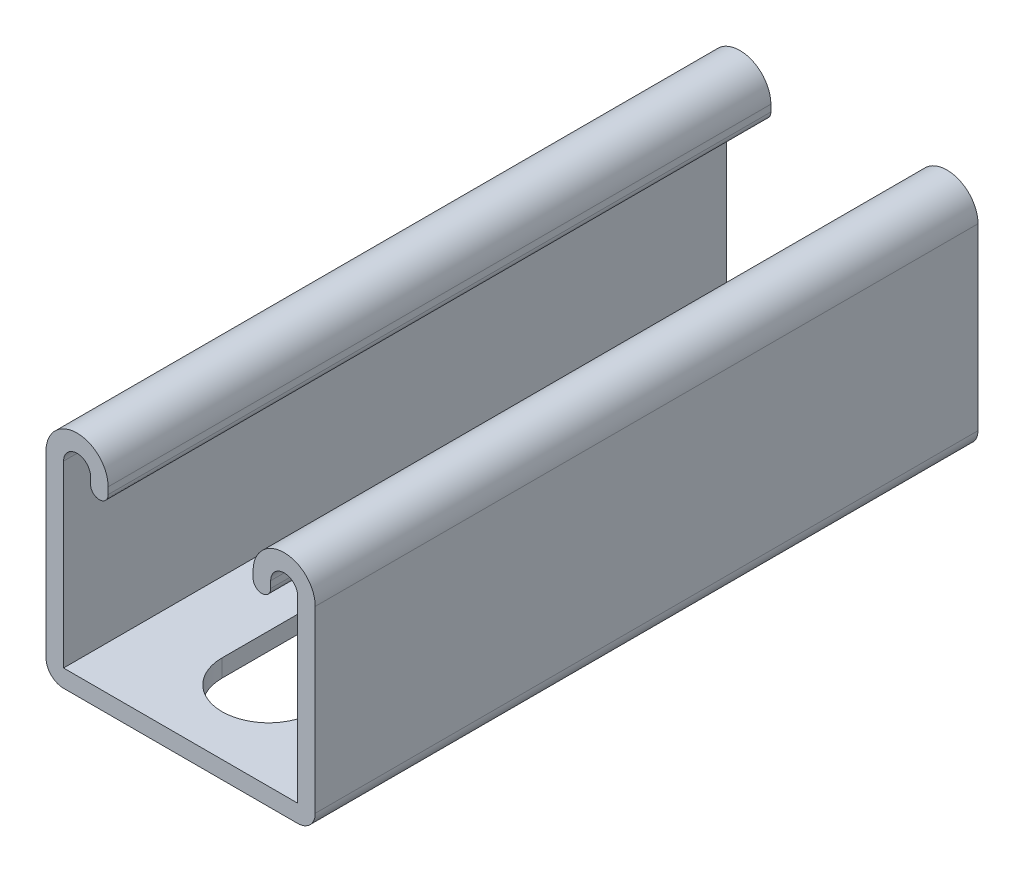
ISO-10303-21;
HEADER;
FILE_DESCRIPTION(('STEP AP214'),'2;1');
FILE_NAME('part.step','',(''),(''),'','','');
FILE_SCHEMA(('AUTOMOTIVE_DESIGN { 1 0 10303 214 1 1 1 1 }'));
ENDSEC;
DATA;
#1=APPLICATION_CONTEXT('core data for automotive mechanical design processes');
#2=APPLICATION_PROTOCOL_DEFINITION('international standard','automotive_design',2000,#1);
#3=PRODUCT_CONTEXT('',#1,'mechanical');
#4=PRODUCT('Part','Part','',(#3));
#5=PRODUCT_RELATED_PRODUCT_CATEGORY('part','',(#4));
#6=PRODUCT_DEFINITION_FORMATION('','',#4);
#7=PRODUCT_DEFINITION_CONTEXT('part definition',#1,'design');
#8=PRODUCT_DEFINITION('design','',#6,#7);
#9=PRODUCT_DEFINITION_SHAPE('','',#8);
#10=(LENGTH_UNIT() NAMED_UNIT(*) SI_UNIT(.MILLI.,.METRE.));
#11=(NAMED_UNIT(*) PLANE_ANGLE_UNIT() SI_UNIT($,.RADIAN.));
#12=(NAMED_UNIT(*) SI_UNIT($,.STERADIAN.) SOLID_ANGLE_UNIT());
#13=UNCERTAINTY_MEASURE_WITH_UNIT(LENGTH_MEASURE(1.E-05),#10,'distance_accuracy_value','');
#14=(GEOMETRIC_REPRESENTATION_CONTEXT(3) GLOBAL_UNCERTAINTY_ASSIGNED_CONTEXT((#13)) GLOBAL_UNIT_ASSIGNED_CONTEXT((#10,
#11,#12)) REPRESENTATION_CONTEXT('',''));
#15=CARTESIAN_POINT('',(0.,0.,0.));
#16=DIRECTION('',(0.,0.,1.));
#17=DIRECTION('',(1.,0.,0.));
#18=AXIS2_PLACEMENT_3D('',#15,#16,#17);
#19=CARTESIAN_POINT('',(-15.875,15.1511,101.6));
#20=DIRECTION('',(0.,0.,-1.));
#21=DIRECTION('',(-1.,0.,0.));
#22=AXIS2_PLACEMENT_3D('',#19,#20,#21);
#23=CYLINDRICAL_SURFACE('',#22,4.7625);
#24=CARTESIAN_POINT('',(-15.875,15.1511,0.));
#25=DIRECTION('',(0.,0.,1.));
#26=DIRECTION('',(-1.,0.,0.));
#27=AXIS2_PLACEMENT_3D('',#24,#25,#26);
#28=CIRCLE('',#27,4.7625);
#29=CARTESIAN_POINT('',(-11.1125,15.1511,0.));
#30=VERTEX_POINT('',#29);
#31=CARTESIAN_POINT('',(-20.6375,15.1511,0.));
#32=VERTEX_POINT('',#31);
#33=EDGE_CURVE('E253',#30,#32,#28,.T.);
#34=ORIENTED_EDGE('',*,*,#33,.T.);
#35=DIRECTION('',(0.,0.,-1.));
#36=VECTOR('',#35,1.);
#37=CARTESIAN_POINT('',(-20.6375,15.1511,101.6));
#38=LINE('',#37,#36);
#39=CARTESIAN_POINT('',(-20.6375,15.1511,101.6));
#40=VERTEX_POINT('',#39);
#41=EDGE_CURVE('E384',#40,#32,#38,.T.);
#42=ORIENTED_EDGE('',*,*,#41,.F.);
#43=CARTESIAN_POINT('',(-15.875,15.1511,101.6));
#44=DIRECTION('',(0.,0.,1.));
#45=DIRECTION('',(-1.,0.,0.));
#46=AXIS2_PLACEMENT_3D('',#43,#44,#45);
#47=CIRCLE('',#46,4.7625);
#48=CARTESIAN_POINT('',(-11.1125,15.1511,101.6));
#49=VERTEX_POINT('',#48);
#50=EDGE_CURVE('E260',#49,#40,#47,.T.);
#51=ORIENTED_EDGE('',*,*,#50,.F.);
#52=DIRECTION('',(0.,0.,-1.));
#53=VECTOR('',#52,1.);
#54=CARTESIAN_POINT('',(-11.1125,15.1511,101.6));
#55=LINE('',#54,#53);
#56=EDGE_CURVE('E298',#49,#30,#55,.T.);
#57=ORIENTED_EDGE('',*,*,#56,.T.);
#58=EDGE_LOOP('',(#34,#42,#51,#57));
#59=FACE_BOUND('',#58,.T.);
#60=ADVANCED_FACE('F32',(#59),#23,.T.);
#61=CARTESIAN_POINT('',(-20.6375,15.1511,101.6));
#62=DIRECTION('',(1.,0.,0.));
#63=DIRECTION('',(0.,1.,0.));
#64=AXIS2_PLACEMENT_3D('',#61,#62,#63);
#65=PLANE('',#64);
#66=DIRECTION('',(0.,-1.,0.));
#67=VECTOR('',#66,1.);
#68=CARTESIAN_POINT('',(-20.6375,15.1511,0.));
#69=LINE('',#68,#67);
#70=CARTESIAN_POINT('',(-20.6375,-12.319,0.));
#71=VERTEX_POINT('',#70);
#72=EDGE_CURVE('E301',#32,#71,#69,.T.);
#73=ORIENTED_EDGE('',*,*,#72,.T.);
#74=DIRECTION('',(0.,0.,-1.));
#75=VECTOR('',#74,1.);
#76=CARTESIAN_POINT('',(-20.6375,-12.319,101.6));
#77=LINE('',#76,#75);
#78=CARTESIAN_POINT('',(-20.6375,-12.319,101.6));
#79=VERTEX_POINT('',#78);
#80=EDGE_CURVE('E381',#79,#71,#77,.T.);
#81=ORIENTED_EDGE('',*,*,#80,.F.);
#82=DIRECTION('',(0.,-1.,0.));
#83=VECTOR('',#82,1.);
#84=CARTESIAN_POINT('',(-20.6375,15.1511,101.6));
#85=LINE('',#84,#83);
#86=EDGE_CURVE('E263',#40,#79,#85,.T.);
#87=ORIENTED_EDGE('',*,*,#86,.F.);
#88=ORIENTED_EDGE('',*,*,#41,.T.);
#89=EDGE_LOOP('',(#73,#81,#87,#88));
#90=FACE_BOUND('',#89,.T.);
#91=ADVANCED_FACE('F425',(#90),#65,.F.);
#92=CARTESIAN_POINT('',(-17.9451,-12.319,101.6));
#93=DIRECTION('',(0.,0.,-1.));
#94=DIRECTION('',(-1.,0.,0.));
#95=AXIS2_PLACEMENT_3D('',#92,#93,#94);
#96=CYLINDRICAL_SURFACE('',#95,2.6924);
#97=CARTESIAN_POINT('',(-17.9451,-12.319,0.));
#98=DIRECTION('',(0.,0.,1.));
#99=DIRECTION('',(-1.,0.,0.));
#100=AXIS2_PLACEMENT_3D('',#97,#98,#99);
#101=CIRCLE('',#100,2.6924);
#102=CARTESIAN_POINT('',(-17.9451,-15.0114,0.));
#103=VERTEX_POINT('',#102);
#104=EDGE_CURVE('E303',#71,#103,#101,.T.);
#105=ORIENTED_EDGE('',*,*,#104,.T.);
#106=DIRECTION('',(0.,0.,-1.));
#107=VECTOR('',#106,1.);
#108=CARTESIAN_POINT('',(-17.9451,-15.0114,101.6));
#109=LINE('',#108,#107);
#110=CARTESIAN_POINT('',(-17.9451,-15.0114,101.6));
#111=VERTEX_POINT('',#110);
#112=EDGE_CURVE('E378',#111,#103,#109,.T.);
#113=ORIENTED_EDGE('',*,*,#112,.F.);
#114=CARTESIAN_POINT('',(-17.9451,-12.319,101.6));
#115=DIRECTION('',(0.,0.,1.));
#116=DIRECTION('',(-1.,0.,0.));
#117=AXIS2_PLACEMENT_3D('',#114,#115,#116);
#118=CIRCLE('',#117,2.6924);
#119=EDGE_CURVE('E266',#79,#111,#118,.T.);
#120=ORIENTED_EDGE('',*,*,#119,.F.);
#121=ORIENTED_EDGE('',*,*,#80,.T.);
#122=EDGE_LOOP('',(#105,#113,#120,#121));
#123=FACE_BOUND('',#122,.T.);
#124=ADVANCED_FACE('F430',(#123),#96,.T.);
#125=CARTESIAN_POINT('',(-17.9451,-15.0114,101.6));
#126=DIRECTION('',(0.,1.,0.));
#127=DIRECTION('',(-1.,0.,0.));
#128=AXIS2_PLACEMENT_3D('',#125,#126,#127);
#129=PLANE('',#128);
#130=DIRECTION('',(0.,0.,-1.));
#131=VECTOR('',#130,1.);
#132=CARTESIAN_POINT('',(-7.14375,-15.0113999999917,73.81875));
#133=LINE('',#132,#131);
#134=CARTESIAN_POINT('',(-7.14375,-15.0114,88.10625));
#135=VERTEX_POINT('',#134);
#136=CARTESIAN_POINT('',(-7.14375,-15.0113999999917,73.81875));
#137=VERTEX_POINT('',#136);
#138=EDGE_CURVE('E206',#135,#137,#133,.T.);
#139=ORIENTED_EDGE('',*,*,#138,.F.);
#140=CARTESIAN_POINT('',(0.,-15.0113999999917,88.10625));
#141=DIRECTION('',(0.,-1.,0.));
#142=DIRECTION('',(1.,0.,0.));
#143=AXIS2_PLACEMENT_3D('',#140,#141,#142);
#144=CIRCLE('',#143,7.14375);
#145=CARTESIAN_POINT('',(7.14375,-15.0113999999917,88.10625));
#146=VERTEX_POINT('',#145);
#147=EDGE_CURVE('E46',#146,#135,#144,.T.);
#148=ORIENTED_EDGE('',*,*,#147,.F.);
#149=DIRECTION('',(0.,0.,1.));
#150=VECTOR('',#149,1.);
#151=CARTESIAN_POINT('',(7.14375,-15.0113999999917,88.10625));
#152=LINE('',#151,#150);
#153=CARTESIAN_POINT('',(7.14375,-15.0113999999917,73.81875));
#154=VERTEX_POINT('',#153);
#155=EDGE_CURVE('E222',#154,#146,#152,.T.);
#156=ORIENTED_EDGE('',*,*,#155,.F.);
#157=CARTESIAN_POINT('',(0.,-15.0113999999917,73.81875));
#158=DIRECTION('',(0.,-1.,0.));
#159=DIRECTION('',(1.,0.,0.));
#160=AXIS2_PLACEMENT_3D('',#157,#158,#159);
#161=CIRCLE('',#160,7.14375);
#162=EDGE_CURVE('E216',#137,#154,#161,.T.);
#163=ORIENTED_EDGE('',*,*,#162,.F.);
#164=EDGE_LOOP('',(#139,#148,#156,#163));
#165=FACE_BOUND('',#164,.T.);
#166=DIRECTION('',(0.,0.,-1.));
#167=VECTOR('',#166,1.);
#168=CARTESIAN_POINT('',(-7.14375,-15.0113999999917,23.01875));
#169=LINE('',#168,#167);
#170=CARTESIAN_POINT('',(-7.14375,-15.0114,37.30625));
#171=VERTEX_POINT('',#170);
#172=CARTESIAN_POINT('',(-7.14375,-15.0113999999917,23.01875));
#173=VERTEX_POINT('',#172);
#174=EDGE_CURVE('E241',#171,#173,#169,.T.);
#175=ORIENTED_EDGE('',*,*,#174,.F.);
#176=CARTESIAN_POINT('',(0.,-15.0113999999917,37.30625));
#177=DIRECTION('',(0.,-1.,0.));
#178=DIRECTION('',(1.,0.,0.));
#179=AXIS2_PLACEMENT_3D('',#176,#177,#178);
#180=CIRCLE('',#179,7.14375);
#181=CARTESIAN_POINT('',(7.14375,-15.0113999999917,37.30625));
#182=VERTEX_POINT('',#181);
#183=EDGE_CURVE('E239',#182,#171,#180,.T.);
#184=ORIENTED_EDGE('',*,*,#183,.F.);
#185=DIRECTION('',(0.,0.,1.));
#186=VECTOR('',#185,1.);
#187=CARTESIAN_POINT('',(7.14375,-15.0113999999917,37.30625));
#188=LINE('',#187,#186);
#189=CARTESIAN_POINT('',(7.14375,-15.0113999999917,23.01875));
#190=VERTEX_POINT('',#189);
#191=EDGE_CURVE('E247',#190,#182,#188,.T.);
#192=ORIENTED_EDGE('',*,*,#191,.F.);
#193=CARTESIAN_POINT('',(0.,-15.0113999999917,23.01875));
#194=DIRECTION('',(0.,-1.,0.));
#195=DIRECTION('',(1.,0.,0.));
#196=AXIS2_PLACEMENT_3D('',#193,#194,#195);
#197=CIRCLE('',#196,7.14375);
#198=EDGE_CURVE('E244',#173,#190,#197,.T.);
#199=ORIENTED_EDGE('',*,*,#198,.F.);
#200=EDGE_LOOP('',(#175,#184,#192,#199));
#201=FACE_BOUND('',#200,.T.);
#202=DIRECTION('',(1.,0.,0.));
#203=VECTOR('',#202,1.);
#204=CARTESIAN_POINT('',(-17.9451,-15.0114,0.));
#205=LINE('',#204,#203);
#206=CARTESIAN_POINT('',(17.9451,-15.0114,0.));
#207=VERTEX_POINT('',#206);
#208=EDGE_CURVE('E305',#103,#207,#205,.T.);
#209=ORIENTED_EDGE('',*,*,#208,.T.);
#210=DIRECTION('',(0.,0.,-1.));
#211=VECTOR('',#210,1.);
#212=CARTESIAN_POINT('',(17.9451,-15.0114,101.6));
#213=LINE('',#212,#211);
#214=CARTESIAN_POINT('',(17.9451,-15.0114,101.6));
#215=VERTEX_POINT('',#214);
#216=EDGE_CURVE('E375',#215,#207,#213,.T.);
#217=ORIENTED_EDGE('',*,*,#216,.F.);
#218=DIRECTION('',(1.,0.,0.));
#219=VECTOR('',#218,1.);
#220=CARTESIAN_POINT('',(-17.9451,-15.0114,101.6));
#221=LINE('',#220,#219);
#222=EDGE_CURVE('E268',#111,#215,#221,.T.);
#223=ORIENTED_EDGE('',*,*,#222,.F.);
#224=ORIENTED_EDGE('',*,*,#112,.T.);
#225=EDGE_LOOP('',(#209,#217,#223,#224));
#226=FACE_BOUND('',#225,.T.);
#227=ADVANCED_FACE('F220',(#165,#201,#226),#129,.F.);
#228=CARTESIAN_POINT('',(17.9451,-12.319,101.6));
#229=DIRECTION('',(0.,0.,-1.));
#230=DIRECTION('',(-1.,0.,0.));
#231=AXIS2_PLACEMENT_3D('',#228,#229,#230);
#232=CYLINDRICAL_SURFACE('',#231,2.6924);
#233=CARTESIAN_POINT('',(17.9451,-12.319,0.));
#234=DIRECTION('',(0.,0.,1.));
#235=DIRECTION('',(1.,0.,0.));
#236=AXIS2_PLACEMENT_3D('',#233,#234,#235);
#237=CIRCLE('',#236,2.6924);
#238=CARTESIAN_POINT('',(20.6375,-12.319,0.));
#239=VERTEX_POINT('',#238);
#240=EDGE_CURVE('E307',#207,#239,#237,.T.);
#241=ORIENTED_EDGE('',*,*,#240,.T.);
#242=DIRECTION('',(0.,0.,-1.));
#243=VECTOR('',#242,1.);
#244=CARTESIAN_POINT('',(20.6375,-12.319,101.6));
#245=LINE('',#244,#243);
#246=CARTESIAN_POINT('',(20.6375,-12.319,101.6));
#247=VERTEX_POINT('',#246);
#248=EDGE_CURVE('E372',#247,#239,#245,.T.);
#249=ORIENTED_EDGE('',*,*,#248,.F.);
#250=CARTESIAN_POINT('',(17.9451,-12.319,101.6));
#251=DIRECTION('',(0.,0.,1.));
#252=DIRECTION('',(1.,0.,0.));
#253=AXIS2_PLACEMENT_3D('',#250,#251,#252);
#254=CIRCLE('',#253,2.6924);
#255=EDGE_CURVE('E270',#215,#247,#254,.T.);
#256=ORIENTED_EDGE('',*,*,#255,.F.);
#257=ORIENTED_EDGE('',*,*,#216,.T.);
#258=EDGE_LOOP('',(#241,#249,#256,#257));
#259=FACE_BOUND('',#258,.T.);
#260=ADVANCED_FACE('F510',(#259),#232,.T.);
#261=CARTESIAN_POINT('',(20.6375,-12.319,101.6));
#262=DIRECTION('',(-1.,0.,0.));
#263=DIRECTION('',(0.,0.,1.));
#264=AXIS2_PLACEMENT_3D('',#261,#262,#263);
#265=PLANE('',#264);
#266=DIRECTION('',(0.,1.,0.));
#267=VECTOR('',#266,1.);
#268=CARTESIAN_POINT('',(20.6375,-12.319,0.));
#269=LINE('',#268,#267);
#270=CARTESIAN_POINT('',(20.6375,15.1511,0.));
#271=VERTEX_POINT('',#270);
#272=EDGE_CURVE('E309',#239,#271,#269,.T.);
#273=ORIENTED_EDGE('',*,*,#272,.T.);
#274=DIRECTION('',(0.,0.,-1.));
#275=VECTOR('',#274,1.);
#276=CARTESIAN_POINT('',(20.6375,15.1511,101.6));
#277=LINE('',#276,#275);
#278=CARTESIAN_POINT('',(20.6375,15.1511,101.6));
#279=VERTEX_POINT('',#278);
#280=EDGE_CURVE('E369',#279,#271,#277,.T.);
#281=ORIENTED_EDGE('',*,*,#280,.F.);
#282=DIRECTION('',(0.,1.,0.));
#283=VECTOR('',#282,1.);
#284=CARTESIAN_POINT('',(20.6375,-12.319,101.6));
#285=LINE('',#284,#283);
#286=EDGE_CURVE('E272',#247,#279,#285,.T.);
#287=ORIENTED_EDGE('',*,*,#286,.F.);
#288=ORIENTED_EDGE('',*,*,#248,.T.);
#289=EDGE_LOOP('',(#273,#281,#287,#288));
#290=FACE_BOUND('',#289,.T.);
#291=ADVANCED_FACE('F506',(#290),#265,.F.);
#292=CARTESIAN_POINT('',(15.875,15.1511,101.6));
#293=DIRECTION('',(0.,0.,-1.));
#294=DIRECTION('',(-1.,0.,0.));
#295=AXIS2_PLACEMENT_3D('',#292,#293,#294);
#296=CYLINDRICAL_SURFACE('',#295,4.7625);
#297=CARTESIAN_POINT('',(15.875,15.1511,0.));
#298=DIRECTION('',(0.,0.,1.));
#299=DIRECTION('',(1.,0.,0.));
#300=AXIS2_PLACEMENT_3D('',#297,#298,#299);
#301=CIRCLE('',#300,4.7625);
#302=CARTESIAN_POINT('',(11.1125,15.1511,0.));
#303=VERTEX_POINT('',#302);
#304=EDGE_CURVE('E311',#271,#303,#301,.T.);
#305=ORIENTED_EDGE('',*,*,#304,.T.);
#306=DIRECTION('',(0.,0.,-1.));
#307=VECTOR('',#306,1.);
#308=CARTESIAN_POINT('',(11.1125,15.1511,101.6));
#309=LINE('',#308,#307);
#310=CARTESIAN_POINT('',(11.1125,15.1511,101.6));
#311=VERTEX_POINT('',#310);
#312=EDGE_CURVE('E366',#311,#303,#309,.T.);
#313=ORIENTED_EDGE('',*,*,#312,.F.);
#314=CARTESIAN_POINT('',(15.875,15.1511,101.6));
#315=DIRECTION('',(0.,0.,1.));
#316=DIRECTION('',(1.,0.,0.));
#317=AXIS2_PLACEMENT_3D('',#314,#315,#316);
#318=CIRCLE('',#317,4.7625);
#319=EDGE_CURVE('E274',#279,#311,#318,.T.);
#320=ORIENTED_EDGE('',*,*,#319,.F.);
#321=ORIENTED_EDGE('',*,*,#280,.T.);
#322=EDGE_LOOP('',(#305,#313,#320,#321));
#323=FACE_BOUND('',#322,.T.);
#324=ADVANCED_FACE('F501',(#323),#296,.T.);
#325=CARTESIAN_POINT('',(11.1125,15.1511,101.6));
#326=DIRECTION('',(1.,0.,0.));
#327=DIRECTION('',(0.,1.,0.));
#328=AXIS2_PLACEMENT_3D('',#325,#326,#327);
#329=PLANE('',#328);
#330=DIRECTION('',(0.,-1.,0.));
#331=VECTOR('',#330,1.);
#332=CARTESIAN_POINT('',(11.1125,15.1511,0.));
#333=LINE('',#332,#331);
#334=CARTESIAN_POINT('',(11.1125,14.11605,0.));
#335=VERTEX_POINT('',#334);
#336=EDGE_CURVE('E313',#303,#335,#333,.T.);
#337=ORIENTED_EDGE('',*,*,#336,.T.);
#338=DIRECTION('',(0.,0.,-1.));
#339=VECTOR('',#338,1.);
#340=CARTESIAN_POINT('',(11.1125,14.11605,101.6));
#341=LINE('',#340,#339);
#342=CARTESIAN_POINT('',(11.1125,14.11605,101.6));
#343=VERTEX_POINT('',#342);
#344=EDGE_CURVE('E363',#343,#335,#341,.T.);
#345=ORIENTED_EDGE('',*,*,#344,.F.);
#346=DIRECTION('',(0.,-1.,0.));
#347=VECTOR('',#346,1.);
#348=CARTESIAN_POINT('',(11.1125,15.1511,101.6));
#349=LINE('',#348,#347);
#350=EDGE_CURVE('E276',#311,#343,#349,.T.);
#351=ORIENTED_EDGE('',*,*,#350,.F.);
#352=ORIENTED_EDGE('',*,*,#312,.T.);
#353=EDGE_LOOP('',(#337,#345,#351,#352));
#354=FACE_BOUND('',#353,.T.);
#355=ADVANCED_FACE('F495',(#354),#329,.F.);
#356=CARTESIAN_POINT('',(12.4587,14.11605,101.6));
#357=DIRECTION('',(0.,0.,-1.));
#358=DIRECTION('',(-1.,0.,0.));
#359=AXIS2_PLACEMENT_3D('',#356,#357,#358);
#360=CYLINDRICAL_SURFACE('',#359,1.3462);
#361=CARTESIAN_POINT('',(12.4587,14.11605,0.));
#362=DIRECTION('',(0.,0.,1.));
#363=DIRECTION('',(1.,0.,0.));
#364=AXIS2_PLACEMENT_3D('',#361,#362,#363);
#365=CIRCLE('',#364,1.3462);
#366=CARTESIAN_POINT('',(13.8049,14.11605,0.));
#367=VERTEX_POINT('',#366);
#368=EDGE_CURVE('E315',#335,#367,#365,.T.);
#369=ORIENTED_EDGE('',*,*,#368,.T.);
#370=DIRECTION('',(0.,0.,-1.));
#371=VECTOR('',#370,1.);
#372=CARTESIAN_POINT('',(13.8049,14.11605,101.6));
#373=LINE('',#372,#371);
#374=CARTESIAN_POINT('',(13.8049,14.11605,101.6));
#375=VERTEX_POINT('',#374);
#376=EDGE_CURVE('E360',#375,#367,#373,.T.);
#377=ORIENTED_EDGE('',*,*,#376,.F.);
#378=CARTESIAN_POINT('',(12.4587,14.11605,101.6));
#379=DIRECTION('',(0.,0.,1.));
#380=DIRECTION('',(1.,0.,0.));
#381=AXIS2_PLACEMENT_3D('',#378,#379,#380);
#382=CIRCLE('',#381,1.3462);
#383=EDGE_CURVE('E278',#343,#375,#382,.T.);
#384=ORIENTED_EDGE('',*,*,#383,.F.);
#385=ORIENTED_EDGE('',*,*,#344,.T.);
#386=EDGE_LOOP('',(#369,#377,#384,#385));
#387=FACE_BOUND('',#386,.T.);
#388=ADVANCED_FACE('F491',(#387),#360,.T.);
#389=CARTESIAN_POINT('',(13.8049,15.1511,101.6));
#390=DIRECTION('',(-1.,0.,0.));
#391=DIRECTION('',(0.,0.,1.));
#392=AXIS2_PLACEMENT_3D('',#389,#390,#391);
#393=PLANE('',#392);
#394=DIRECTION('',(0.,1.,0.));
#395=VECTOR('',#394,1.);
#396=CARTESIAN_POINT('',(13.8049,15.1511,0.));
#397=LINE('',#396,#395);
#398=CARTESIAN_POINT('',(13.8049,15.1511,0.));
#399=VERTEX_POINT('',#398);
#400=EDGE_CURVE('E317',#367,#399,#397,.T.);
#401=ORIENTED_EDGE('',*,*,#400,.T.);
#402=DIRECTION('',(0.,0.,-1.));
#403=VECTOR('',#402,1.);
#404=CARTESIAN_POINT('',(13.8049,15.1511,101.6));
#405=LINE('',#404,#403);
#406=CARTESIAN_POINT('',(13.8049,15.1511,101.6));
#407=VERTEX_POINT('',#406);
#408=EDGE_CURVE('E357',#407,#399,#405,.T.);
#409=ORIENTED_EDGE('',*,*,#408,.F.);
#410=DIRECTION('',(0.,1.,0.));
#411=VECTOR('',#410,1.);
#412=CARTESIAN_POINT('',(13.8049,15.1511,101.6));
#413=LINE('',#412,#411);
#414=EDGE_CURVE('E280',#375,#407,#413,.T.);
#415=ORIENTED_EDGE('',*,*,#414,.F.);
#416=ORIENTED_EDGE('',*,*,#376,.T.);
#417=EDGE_LOOP('',(#401,#409,#415,#416));
#418=FACE_BOUND('',#417,.T.);
#419=ADVANCED_FACE('F486',(#418),#393,.F.);
#420=CARTESIAN_POINT('',(15.875,15.1511,101.6));
#421=DIRECTION('',(0.,0.,-1.));
#422=DIRECTION('',(-1.,0.,0.));
#423=AXIS2_PLACEMENT_3D('',#420,#421,#422);
#424=CYLINDRICAL_SURFACE('',#423,2.0701);
#425=CARTESIAN_POINT('',(15.875,15.1511,0.));
#426=DIRECTION('',(0.,0.,-1.));
#427=DIRECTION('',(1.,0.,0.));
#428=AXIS2_PLACEMENT_3D('',#425,#426,#427);
#429=CIRCLE('',#428,2.0701);
#430=CARTESIAN_POINT('',(17.9451,15.1511,0.));
#431=VERTEX_POINT('',#430);
#432=EDGE_CURVE('E319',#399,#431,#429,.T.);
#433=ORIENTED_EDGE('',*,*,#432,.T.);
#434=DIRECTION('',(0.,0.,-1.));
#435=VECTOR('',#434,1.);
#436=CARTESIAN_POINT('',(17.9451,15.1511,101.6));
#437=LINE('',#436,#435);
#438=CARTESIAN_POINT('',(17.9451,15.1511,101.6));
#439=VERTEX_POINT('',#438);
#440=EDGE_CURVE('E354',#439,#431,#437,.T.);
#441=ORIENTED_EDGE('',*,*,#440,.F.);
#442=CARTESIAN_POINT('',(15.875,15.1511,101.6));
#443=DIRECTION('',(0.,0.,-1.));
#444=DIRECTION('',(1.,0.,0.));
#445=AXIS2_PLACEMENT_3D('',#442,#443,#444);
#446=CIRCLE('',#445,2.0701);
#447=EDGE_CURVE('E282',#407,#439,#446,.T.);
#448=ORIENTED_EDGE('',*,*,#447,.F.);
#449=ORIENTED_EDGE('',*,*,#408,.T.);
#450=EDGE_LOOP('',(#433,#441,#448,#449));
#451=FACE_BOUND('',#450,.T.);
#452=ADVANCED_FACE('F480',(#451),#424,.F.);
#453=CARTESIAN_POINT('',(17.9451,-12.319,101.6));
#454=DIRECTION('',(1.,0.,0.));
#455=DIRECTION('',(0.,1.,0.));
#456=AXIS2_PLACEMENT_3D('',#453,#454,#455);
#457=PLANE('',#456);
#458=DIRECTION('',(0.,-1.,0.));
#459=VECTOR('',#458,1.);
#460=CARTESIAN_POINT('',(17.9451,-12.319,0.));
#461=LINE('',#460,#459);
#462=CARTESIAN_POINT('',(17.9451,-12.319,0.));
#463=VERTEX_POINT('',#462);
#464=EDGE_CURVE('E321',#431,#463,#461,.T.);
#465=ORIENTED_EDGE('',*,*,#464,.T.);
#466=DIRECTION('',(0.,0.,-1.));
#467=VECTOR('',#466,1.);
#468=CARTESIAN_POINT('',(17.9451,-12.319,101.6));
#469=LINE('',#468,#467);
#470=CARTESIAN_POINT('',(17.9451,-12.319,101.6));
#471=VERTEX_POINT('',#470);
#472=EDGE_CURVE('E351',#471,#463,#469,.T.);
#473=ORIENTED_EDGE('',*,*,#472,.F.);
#474=DIRECTION('',(0.,-1.,0.));
#475=VECTOR('',#474,1.);
#476=CARTESIAN_POINT('',(17.9451,-12.319,101.6));
#477=LINE('',#476,#475);
#478=EDGE_CURVE('E284',#439,#471,#477,.T.);
#479=ORIENTED_EDGE('',*,*,#478,.F.);
#480=ORIENTED_EDGE('',*,*,#440,.T.);
#481=EDGE_LOOP('',(#465,#473,#479,#480));
#482=FACE_BOUND('',#481,.T.);
#483=ADVANCED_FACE('F476',(#482),#457,.F.);
#484=CARTESIAN_POINT('',(-17.9451,-12.319,101.6));
#485=DIRECTION('',(0.,-1.,0.));
#486=DIRECTION('',(0.,0.,-1.));
#487=AXIS2_PLACEMENT_3D('',#484,#485,#486);
#488=PLANE('',#487);
#489=DIRECTION('',(0.,0.,1.));
#490=VECTOR('',#489,1.);
#491=CARTESIAN_POINT('',(7.14374999999998,-12.319,152.4));
#492=LINE('',#491,#490);
#493=CARTESIAN_POINT('',(7.14375,-12.319,73.81875));
#494=VERTEX_POINT('',#493);
#495=CARTESIAN_POINT('',(7.14375,-12.319,88.10625));
#496=VERTEX_POINT('',#495);
#497=EDGE_CURVE('E232',#494,#496,#492,.T.);
#498=ORIENTED_EDGE('',*,*,#497,.T.);
#499=CARTESIAN_POINT('',(0.,-12.319,88.10625));
#500=DIRECTION('',(0.,-1.,0.));
#501=DIRECTION('',(0.,0.,-1.));
#502=AXIS2_PLACEMENT_3D('',#499,#500,#501);
#503=CIRCLE('',#502,7.14375);
#504=CARTESIAN_POINT('',(-7.14375,-12.319,88.10625));
#505=VERTEX_POINT('',#504);
#506=EDGE_CURVE('E236',#496,#505,#503,.T.);
#507=ORIENTED_EDGE('',*,*,#506,.T.);
#508=DIRECTION('',(0.,0.,-1.));
#509=VECTOR('',#508,1.);
#510=CARTESIAN_POINT('',(-7.14375,-12.319,152.4));
#511=LINE('',#510,#509);
#512=CARTESIAN_POINT('',(-7.14375,-12.319,73.81875));
#513=VERTEX_POINT('',#512);
#514=EDGE_CURVE('E213',#505,#513,#511,.T.);
#515=ORIENTED_EDGE('',*,*,#514,.T.);
#516=CARTESIAN_POINT('',(0.,-12.319,73.81875));
#517=DIRECTION('',(0.,-1.,0.));
#518=DIRECTION('',(0.,0.,-1.));
#519=AXIS2_PLACEMENT_3D('',#516,#517,#518);
#520=CIRCLE('',#519,7.14375);
#521=EDGE_CURVE('E54',#513,#494,#520,.T.);
#522=ORIENTED_EDGE('',*,*,#521,.T.);
#523=EDGE_LOOP('',(#498,#507,#515,#522));
#524=FACE_BOUND('',#523,.T.);
#525=DIRECTION('',(0.,0.,1.));
#526=VECTOR('',#525,1.);
#527=CARTESIAN_POINT('',(7.14374999999998,-12.319,101.6));
#528=LINE('',#527,#526);
#529=CARTESIAN_POINT('',(7.14375,-12.319,23.01875));
#530=VERTEX_POINT('',#529);
#531=CARTESIAN_POINT('',(7.14375,-12.319,37.30625));
#532=VERTEX_POINT('',#531);
#533=EDGE_CURVE('E39',#530,#532,#528,.T.);
#534=ORIENTED_EDGE('',*,*,#533,.T.);
#535=CARTESIAN_POINT('',(0.,-12.319,37.30625));
#536=DIRECTION('',(0.,-1.,0.));
#537=DIRECTION('',(0.,0.,-1.));
#538=AXIS2_PLACEMENT_3D('',#535,#536,#537);
#539=CIRCLE('',#538,7.14375);
#540=CARTESIAN_POINT('',(-7.14375,-12.319,37.30625));
#541=VERTEX_POINT('',#540);
#542=EDGE_CURVE('E11',#532,#541,#539,.T.);
#543=ORIENTED_EDGE('',*,*,#542,.T.);
#544=DIRECTION('',(0.,0.,-1.));
#545=VECTOR('',#544,1.);
#546=CARTESIAN_POINT('',(-7.14375,-12.319,101.6));
#547=LINE('',#546,#545);
#548=CARTESIAN_POINT('',(-7.14375,-12.319,23.01875));
#549=VERTEX_POINT('',#548);
#550=EDGE_CURVE('E387',#541,#549,#547,.T.);
#551=ORIENTED_EDGE('',*,*,#550,.T.);
#552=CARTESIAN_POINT('',(0.,-12.319,23.01875));
#553=DIRECTION('',(0.,-1.,0.));
#554=DIRECTION('',(0.,0.,-1.));
#555=AXIS2_PLACEMENT_3D('',#552,#553,#554);
#556=CIRCLE('',#555,7.14375);
#557=EDGE_CURVE('E390',#549,#530,#556,.T.);
#558=ORIENTED_EDGE('',*,*,#557,.T.);
#559=EDGE_LOOP('',(#534,#543,#551,#558));
#560=FACE_BOUND('',#559,.T.);
#561=DIRECTION('',(-1.,0.,0.));
#562=VECTOR('',#561,1.);
#563=CARTESIAN_POINT('',(-17.9451,-12.319,0.));
#564=LINE('',#563,#562);
#565=CARTESIAN_POINT('',(-17.9451,-12.319,0.));
#566=VERTEX_POINT('',#565);
#567=EDGE_CURVE('E323',#463,#566,#564,.T.);
#568=ORIENTED_EDGE('',*,*,#567,.T.);
#569=DIRECTION('',(0.,0.,-1.));
#570=VECTOR('',#569,1.);
#571=CARTESIAN_POINT('',(-17.9451,-12.319,101.6));
#572=LINE('',#571,#570);
#573=CARTESIAN_POINT('',(-17.9451,-12.319,101.6));
#574=VERTEX_POINT('',#573);
#575=EDGE_CURVE('E348',#574,#566,#572,.T.);
#576=ORIENTED_EDGE('',*,*,#575,.F.);
#577=DIRECTION('',(-1.,0.,0.));
#578=VECTOR('',#577,1.);
#579=CARTESIAN_POINT('',(-17.9451,-12.319,101.6));
#580=LINE('',#579,#578);
#581=EDGE_CURVE('E286',#471,#574,#580,.T.);
#582=ORIENTED_EDGE('',*,*,#581,.F.);
#583=ORIENTED_EDGE('',*,*,#472,.T.);
#584=EDGE_LOOP('',(#568,#576,#582,#583));
#585=FACE_BOUND('',#584,.T.);
#586=ADVANCED_FACE('F394',(#524,#560,#585),#488,.F.);
#587=CARTESIAN_POINT('',(-17.9451,15.1511,101.6));
#588=DIRECTION('',(-1.,0.,0.));
#589=DIRECTION('',(0.,0.,1.));
#590=AXIS2_PLACEMENT_3D('',#587,#588,#589);
#591=PLANE('',#590);
#592=DIRECTION('',(0.,1.,0.));
#593=VECTOR('',#592,1.);
#594=CARTESIAN_POINT('',(-17.9451,15.1511,0.));
#595=LINE('',#594,#593);
#596=CARTESIAN_POINT('',(-17.9451,15.1511,0.));
#597=VERTEX_POINT('',#596);
#598=EDGE_CURVE('E325',#566,#597,#595,.T.);
#599=ORIENTED_EDGE('',*,*,#598,.T.);
#600=DIRECTION('',(0.,0.,-1.));
#601=VECTOR('',#600,1.);
#602=CARTESIAN_POINT('',(-17.9451,15.1511,101.6));
#603=LINE('',#602,#601);
#604=CARTESIAN_POINT('',(-17.9451,15.1511,101.6));
#605=VERTEX_POINT('',#604);
#606=EDGE_CURVE('E345',#605,#597,#603,.T.);
#607=ORIENTED_EDGE('',*,*,#606,.F.);
#608=DIRECTION('',(0.,1.,0.));
#609=VECTOR('',#608,1.);
#610=CARTESIAN_POINT('',(-17.9451,15.1511,101.6));
#611=LINE('',#610,#609);
#612=EDGE_CURVE('E288',#574,#605,#611,.T.);
#613=ORIENTED_EDGE('',*,*,#612,.F.);
#614=ORIENTED_EDGE('',*,*,#575,.T.);
#615=EDGE_LOOP('',(#599,#607,#613,#614));
#616=FACE_BOUND('',#615,.T.);
#617=ADVANCED_FACE('F467',(#616),#591,.F.);
#618=CARTESIAN_POINT('',(-15.875,15.1511,101.6));
#619=DIRECTION('',(0.,0.,-1.));
#620=DIRECTION('',(-1.,0.,0.));
#621=AXIS2_PLACEMENT_3D('',#618,#619,#620);
#622=CYLINDRICAL_SURFACE('',#621,2.0701);
#623=CARTESIAN_POINT('',(-15.875,15.1511,0.));
#624=DIRECTION('',(0.,0.,-1.));
#625=DIRECTION('',(-1.,0.,0.));
#626=AXIS2_PLACEMENT_3D('',#623,#624,#625);
#627=CIRCLE('',#626,2.0701);
#628=CARTESIAN_POINT('',(-13.8049,15.1511,0.));
#629=VERTEX_POINT('',#628);
#630=EDGE_CURVE('E327',#597,#629,#627,.T.);
#631=ORIENTED_EDGE('',*,*,#630,.T.);
#632=DIRECTION('',(0.,0.,-1.));
#633=VECTOR('',#632,1.);
#634=CARTESIAN_POINT('',(-13.8049,15.1511,101.6));
#635=LINE('',#634,#633);
#636=CARTESIAN_POINT('',(-13.8049,15.1511,101.6));
#637=VERTEX_POINT('',#636);
#638=EDGE_CURVE('E342',#637,#629,#635,.T.);
#639=ORIENTED_EDGE('',*,*,#638,.F.);
#640=CARTESIAN_POINT('',(-15.875,15.1511,101.6));
#641=DIRECTION('',(0.,0.,-1.));
#642=DIRECTION('',(-1.,0.,0.));
#643=AXIS2_PLACEMENT_3D('',#640,#641,#642);
#644=CIRCLE('',#643,2.0701);
#645=EDGE_CURVE('E290',#605,#637,#644,.T.);
#646=ORIENTED_EDGE('',*,*,#645,.F.);
#647=ORIENTED_EDGE('',*,*,#606,.T.);
#648=EDGE_LOOP('',(#631,#639,#646,#647));
#649=FACE_BOUND('',#648,.T.);
#650=ADVANCED_FACE('F463',(#649),#622,.F.);
#651=CARTESIAN_POINT('',(-13.8049,15.1511,101.6));
#652=DIRECTION('',(1.,0.,0.));
#653=DIRECTION('',(0.,1.,0.));
#654=AXIS2_PLACEMENT_3D('',#651,#652,#653);
#655=PLANE('',#654);
#656=DIRECTION('',(0.,-1.,0.));
#657=VECTOR('',#656,1.);
#658=CARTESIAN_POINT('',(-13.8049,15.1511,0.));
#659=LINE('',#658,#657);
#660=CARTESIAN_POINT('',(-13.8049,14.11605,0.));
#661=VERTEX_POINT('',#660);
#662=EDGE_CURVE('E329',#629,#661,#659,.T.);
#663=ORIENTED_EDGE('',*,*,#662,.T.);
#664=DIRECTION('',(0.,0.,-1.));
#665=VECTOR('',#664,1.);
#666=CARTESIAN_POINT('',(-13.8049,14.11605,101.6));
#667=LINE('',#666,#665);
#668=CARTESIAN_POINT('',(-13.8049,14.11605,101.6));
#669=VERTEX_POINT('',#668);
#670=EDGE_CURVE('E339',#669,#661,#667,.T.);
#671=ORIENTED_EDGE('',*,*,#670,.F.);
#672=DIRECTION('',(0.,-1.,0.));
#673=VECTOR('',#672,1.);
#674=CARTESIAN_POINT('',(-13.8049,15.1511,101.6));
#675=LINE('',#674,#673);
#676=EDGE_CURVE('E292',#637,#669,#675,.T.);
#677=ORIENTED_EDGE('',*,*,#676,.F.);
#678=ORIENTED_EDGE('',*,*,#638,.T.);
#679=EDGE_LOOP('',(#663,#671,#677,#678));
#680=FACE_BOUND('',#679,.T.);
#681=ADVANCED_FACE('F458',(#680),#655,.F.);
#682=CARTESIAN_POINT('',(-12.4587,14.11605,101.6));
#683=DIRECTION('',(0.,0.,-1.));
#684=DIRECTION('',(-1.,0.,0.));
#685=AXIS2_PLACEMENT_3D('',#682,#683,#684);
#686=CYLINDRICAL_SURFACE('',#685,1.3462);
#687=CARTESIAN_POINT('',(-12.4587,14.11605,0.));
#688=DIRECTION('',(0.,0.,1.));
#689=DIRECTION('',(-1.,0.,0.));
#690=AXIS2_PLACEMENT_3D('',#687,#688,#689);
#691=CIRCLE('',#690,1.3462);
#692=CARTESIAN_POINT('',(-11.1125,14.11605,0.));
#693=VERTEX_POINT('',#692);
#694=EDGE_CURVE('E331',#661,#693,#691,.T.);
#695=ORIENTED_EDGE('',*,*,#694,.T.);
#696=DIRECTION('',(0.,0.,-1.));
#697=VECTOR('',#696,1.);
#698=CARTESIAN_POINT('',(-11.1125,14.11605,101.6));
#699=LINE('',#698,#697);
#700=CARTESIAN_POINT('',(-11.1125,14.11605,101.6));
#701=VERTEX_POINT('',#700);
#702=EDGE_CURVE('E336',#701,#693,#699,.T.);
#703=ORIENTED_EDGE('',*,*,#702,.F.);
#704=CARTESIAN_POINT('',(-12.4587,14.11605,101.6));
#705=DIRECTION('',(0.,0.,1.));
#706=DIRECTION('',(-1.,0.,0.));
#707=AXIS2_PLACEMENT_3D('',#704,#705,#706);
#708=CIRCLE('',#707,1.3462);
#709=EDGE_CURVE('E294',#669,#701,#708,.T.);
#710=ORIENTED_EDGE('',*,*,#709,.F.);
#711=ORIENTED_EDGE('',*,*,#670,.T.);
#712=EDGE_LOOP('',(#695,#703,#710,#711));
#713=FACE_BOUND('',#712,.T.);
#714=ADVANCED_FACE('F452',(#713),#686,.T.);
#715=CARTESIAN_POINT('',(-11.1125,15.1511,101.6));
#716=DIRECTION('',(-1.,0.,0.));
#717=DIRECTION('',(0.,0.,1.));
#718=AXIS2_PLACEMENT_3D('',#715,#716,#717);
#719=PLANE('',#718);
#720=DIRECTION('',(0.,1.,0.));
#721=VECTOR('',#720,1.);
#722=CARTESIAN_POINT('',(-11.1125,15.1511,0.));
#723=LINE('',#722,#721);
#724=EDGE_CURVE('E264',#693,#30,#723,.T.);
#725=ORIENTED_EDGE('',*,*,#724,.T.);
#726=ORIENTED_EDGE('',*,*,#56,.F.);
#727=DIRECTION('',(0.,1.,0.));
#728=VECTOR('',#727,1.);
#729=CARTESIAN_POINT('',(-11.1125,15.1511,101.6));
#730=LINE('',#729,#728);
#731=EDGE_CURVE('E296',#701,#49,#730,.T.);
#732=ORIENTED_EDGE('',*,*,#731,.F.);
#733=ORIENTED_EDGE('',*,*,#702,.T.);
#734=EDGE_LOOP('',(#725,#726,#732,#733));
#735=FACE_BOUND('',#734,.T.);
#736=ADVANCED_FACE('F450',(#735),#719,.F.);
#737=CARTESIAN_POINT('',(-15.875,15.1511,101.6));
#738=DIRECTION('',(0.,0.,-1.));
#739=DIRECTION('',(-1.,0.,0.));
#740=AXIS2_PLACEMENT_3D('',#737,#738,#739);
#741=PLANE('',#740);
#742=ORIENTED_EDGE('',*,*,#50,.T.);
#743=ORIENTED_EDGE('',*,*,#86,.T.);
#744=ORIENTED_EDGE('',*,*,#119,.T.);
#745=ORIENTED_EDGE('',*,*,#222,.T.);
#746=ORIENTED_EDGE('',*,*,#255,.T.);
#747=ORIENTED_EDGE('',*,*,#286,.T.);
#748=ORIENTED_EDGE('',*,*,#319,.T.);
#749=ORIENTED_EDGE('',*,*,#350,.T.);
#750=ORIENTED_EDGE('',*,*,#383,.T.);
#751=ORIENTED_EDGE('',*,*,#414,.T.);
#752=ORIENTED_EDGE('',*,*,#447,.T.);
#753=ORIENTED_EDGE('',*,*,#478,.T.);
#754=ORIENTED_EDGE('',*,*,#581,.T.);
#755=ORIENTED_EDGE('',*,*,#612,.T.);
#756=ORIENTED_EDGE('',*,*,#645,.T.);
#757=ORIENTED_EDGE('',*,*,#676,.T.);
#758=ORIENTED_EDGE('',*,*,#709,.T.);
#759=ORIENTED_EDGE('',*,*,#731,.T.);
#760=EDGE_LOOP('',(#742,#743,#744,#745,#746,#747,#748,#749,#750,#751,#752,#753,#754,#755,#756,
#757,#758,#759));
#761=FACE_BOUND('',#760,.T.);
#762=ADVANCED_FACE('F445',(#761),#741,.F.);
#763=CARTESIAN_POINT('',(-15.875,15.1511,0.));
#764=DIRECTION('',(0.,0.,-1.));
#765=DIRECTION('',(-1.,0.,0.));
#766=AXIS2_PLACEMENT_3D('',#763,#764,#765);
#767=PLANE('',#766);
#768=ORIENTED_EDGE('',*,*,#33,.F.);
#769=ORIENTED_EDGE('',*,*,#724,.F.);
#770=ORIENTED_EDGE('',*,*,#694,.F.);
#771=ORIENTED_EDGE('',*,*,#662,.F.);
#772=ORIENTED_EDGE('',*,*,#630,.F.);
#773=ORIENTED_EDGE('',*,*,#598,.F.);
#774=ORIENTED_EDGE('',*,*,#567,.F.);
#775=ORIENTED_EDGE('',*,*,#464,.F.);
#776=ORIENTED_EDGE('',*,*,#432,.F.);
#777=ORIENTED_EDGE('',*,*,#400,.F.);
#778=ORIENTED_EDGE('',*,*,#368,.F.);
#779=ORIENTED_EDGE('',*,*,#336,.F.);
#780=ORIENTED_EDGE('',*,*,#304,.F.);
#781=ORIENTED_EDGE('',*,*,#272,.F.);
#782=ORIENTED_EDGE('',*,*,#240,.F.);
#783=ORIENTED_EDGE('',*,*,#208,.F.);
#784=ORIENTED_EDGE('',*,*,#104,.F.);
#785=ORIENTED_EDGE('',*,*,#72,.F.);
#786=EDGE_LOOP('',(#768,#769,#770,#771,#772,#773,#774,#775,#776,#777,#778,#779,#780,#781,#782,
#783,#784,#785));
#787=FACE_BOUND('',#786,.T.);
#788=ADVANCED_FACE('F438',(#787),#767,.T.);
#789=CARTESIAN_POINT('',(0.,19.9136,37.30625));
#790=DIRECTION('',(0.,-1.,0.));
#791=DIRECTION('',(1.,0.,0.));
#792=AXIS2_PLACEMENT_3D('',#789,#790,#791);
#793=CYLINDRICAL_SURFACE('',#792,7.14375);
#794=DIRECTION('',(0.,-1.,0.));
#795=VECTOR('',#794,1.);
#796=CARTESIAN_POINT('',(7.14375,19.9136,37.30625));
#797=LINE('',#796,#795);
#798=EDGE_CURVE('E251',#532,#182,#797,.T.);
#799=ORIENTED_EDGE('',*,*,#798,.T.);
#800=ORIENTED_EDGE('',*,*,#183,.T.);
#801=DIRECTION('',(0.,-1.,0.));
#802=VECTOR('',#801,1.);
#803=CARTESIAN_POINT('',(-7.14375,19.9136,37.30625));
#804=LINE('',#803,#802);
#805=EDGE_CURVE('E250',#541,#171,#804,.T.);
#806=ORIENTED_EDGE('',*,*,#805,.F.);
#807=ORIENTED_EDGE('',*,*,#542,.F.);
#808=EDGE_LOOP('',(#799,#800,#806,#807));
#809=FACE_BOUND('',#808,.T.);
#810=ADVANCED_FACE('F410',(#809),#793,.F.);
#811=CARTESIAN_POINT('',(7.14375,19.9136,37.30625));
#812=DIRECTION('',(1.,0.,0.));
#813=DIRECTION('',(0.,0.,-1.));
#814=AXIS2_PLACEMENT_3D('',#811,#812,#813);
#815=PLANE('',#814);
#816=DIRECTION('',(0.,-1.,0.));
#817=VECTOR('',#816,1.);
#818=CARTESIAN_POINT('',(7.14375,19.9136,23.01875));
#819=LINE('',#818,#817);
#820=EDGE_CURVE('E254',#530,#190,#819,.T.);
#821=ORIENTED_EDGE('',*,*,#820,.T.);
#822=ORIENTED_EDGE('',*,*,#191,.T.);
#823=ORIENTED_EDGE('',*,*,#798,.F.);
#824=ORIENTED_EDGE('',*,*,#533,.F.);
#825=EDGE_LOOP('',(#821,#822,#823,#824));
#826=FACE_BOUND('',#825,.T.);
#827=ADVANCED_FACE('F400',(#826),#815,.F.);
#828=CARTESIAN_POINT('',(0.,19.9136,23.01875));
#829=DIRECTION('',(0.,-1.,0.));
#830=DIRECTION('',(1.,0.,0.));
#831=AXIS2_PLACEMENT_3D('',#828,#829,#830);
#832=CYLINDRICAL_SURFACE('',#831,7.14375);
#833=DIRECTION('',(0.,-1.,0.));
#834=VECTOR('',#833,1.);
#835=CARTESIAN_POINT('',(-7.14375,19.9136,23.01875));
#836=LINE('',#835,#834);
#837=EDGE_CURVE('E256',#549,#173,#836,.T.);
#838=ORIENTED_EDGE('',*,*,#837,.T.);
#839=ORIENTED_EDGE('',*,*,#198,.T.);
#840=ORIENTED_EDGE('',*,*,#820,.F.);
#841=ORIENTED_EDGE('',*,*,#557,.F.);
#842=EDGE_LOOP('',(#838,#839,#840,#841));
#843=FACE_BOUND('',#842,.T.);
#844=ADVANCED_FACE('F402',(#843),#832,.F.);
#845=CARTESIAN_POINT('',(-7.14375,19.9136,23.01875));
#846=DIRECTION('',(-1.,0.,0.));
#847=DIRECTION('',(0.,-1.,0.));
#848=AXIS2_PLACEMENT_3D('',#845,#846,#847);
#849=PLANE('',#848);
#850=ORIENTED_EDGE('',*,*,#805,.T.);
#851=ORIENTED_EDGE('',*,*,#174,.T.);
#852=ORIENTED_EDGE('',*,*,#837,.F.);
#853=ORIENTED_EDGE('',*,*,#550,.F.);
#854=EDGE_LOOP('',(#850,#851,#852,#853));
#855=FACE_BOUND('',#854,.T.);
#856=ADVANCED_FACE('F412',(#855),#849,.F.);
#857=CARTESIAN_POINT('',(0.,19.9136,88.10625));
#858=DIRECTION('',(0.,-1.,0.));
#859=DIRECTION('',(1.,0.,0.));
#860=AXIS2_PLACEMENT_3D('',#857,#858,#859);
#861=CYLINDRICAL_SURFACE('',#860,7.14375);
#862=DIRECTION('',(0.,-1.,0.));
#863=VECTOR('',#862,1.);
#864=CARTESIAN_POINT('',(7.14375,19.9136,88.10625));
#865=LINE('',#864,#863);
#866=EDGE_CURVE('E230',#496,#146,#865,.T.);
#867=ORIENTED_EDGE('',*,*,#866,.T.);
#868=ORIENTED_EDGE('',*,*,#147,.T.);
#869=DIRECTION('',(0.,-1.,0.));
#870=VECTOR('',#869,1.);
#871=CARTESIAN_POINT('',(-7.14375,19.9136,88.10625));
#872=LINE('',#871,#870);
#873=EDGE_CURVE('E210',#505,#135,#872,.T.);
#874=ORIENTED_EDGE('',*,*,#873,.F.);
#875=ORIENTED_EDGE('',*,*,#506,.F.);
#876=EDGE_LOOP('',(#867,#868,#874,#875));
#877=FACE_BOUND('',#876,.T.);
#878=ADVANCED_FACE('F414',(#877),#861,.F.);
#879=CARTESIAN_POINT('',(7.14375,19.9136,88.10625));
#880=DIRECTION('',(1.,0.,0.));
#881=DIRECTION('',(0.,0.,-1.));
#882=AXIS2_PLACEMENT_3D('',#879,#880,#881);
#883=PLANE('',#882);
#884=DIRECTION('',(0.,-1.,0.));
#885=VECTOR('',#884,1.);
#886=CARTESIAN_POINT('',(7.14375,19.9136,73.81875));
#887=LINE('',#886,#885);
#888=EDGE_CURVE('E223',#494,#154,#887,.T.);
#889=ORIENTED_EDGE('',*,*,#888,.T.);
#890=ORIENTED_EDGE('',*,*,#155,.T.);
#891=ORIENTED_EDGE('',*,*,#866,.F.);
#892=ORIENTED_EDGE('',*,*,#497,.F.);
#893=EDGE_LOOP('',(#889,#890,#891,#892));
#894=FACE_BOUND('',#893,.T.);
#895=ADVANCED_FACE('F420',(#894),#883,.F.);
#896=CARTESIAN_POINT('',(0.,19.9136,73.81875));
#897=DIRECTION('',(0.,-1.,0.));
#898=DIRECTION('',(1.,0.,0.));
#899=AXIS2_PLACEMENT_3D('',#896,#897,#898);
#900=CYLINDRICAL_SURFACE('',#899,7.14375);
#901=DIRECTION('',(0.,-1.,0.));
#902=VECTOR('',#901,1.);
#903=CARTESIAN_POINT('',(-7.14375,19.9136,73.81875));
#904=LINE('',#903,#902);
#905=EDGE_CURVE('E208',#513,#137,#904,.T.);
#906=ORIENTED_EDGE('',*,*,#905,.T.);
#907=ORIENTED_EDGE('',*,*,#162,.T.);
#908=ORIENTED_EDGE('',*,*,#888,.F.);
#909=ORIENTED_EDGE('',*,*,#521,.F.);
#910=EDGE_LOOP('',(#906,#907,#908,#909));
#911=FACE_BOUND('',#910,.T.);
#912=ADVANCED_FACE('F215',(#911),#900,.F.);
#913=CARTESIAN_POINT('',(-7.14375,19.9136,73.81875));
#914=DIRECTION('',(-1.,0.,0.));
#915=DIRECTION('',(0.,-1.,0.));
#916=AXIS2_PLACEMENT_3D('',#913,#914,#915);
#917=PLANE('',#916);
#918=ORIENTED_EDGE('',*,*,#873,.T.);
#919=ORIENTED_EDGE('',*,*,#138,.T.);
#920=ORIENTED_EDGE('',*,*,#905,.F.);
#921=ORIENTED_EDGE('',*,*,#514,.F.);
#922=EDGE_LOOP('',(#918,#919,#920,#921));
#923=FACE_BOUND('',#922,.T.);
#924=ADVANCED_FACE('F207',(#923),#917,.F.);
#925=CLOSED_SHELL('',(#60,#91,#124,#227,#260,#291,#324,#355,#388,#419,#452,#483,#586,#617,#650,
#681,#714,#736,#762,#788,#810,#827,#844,#856,#878,#895,#912,#924));
#926=MANIFOLD_SOLID_BREP('B2',#925);
#927=ADVANCED_BREP_SHAPE_REPRESENTATION('',(#18,#926),#14);
#928=SHAPE_DEFINITION_REPRESENTATION(#9,#927);
ENDSEC;
END-ISO-10303-21;
